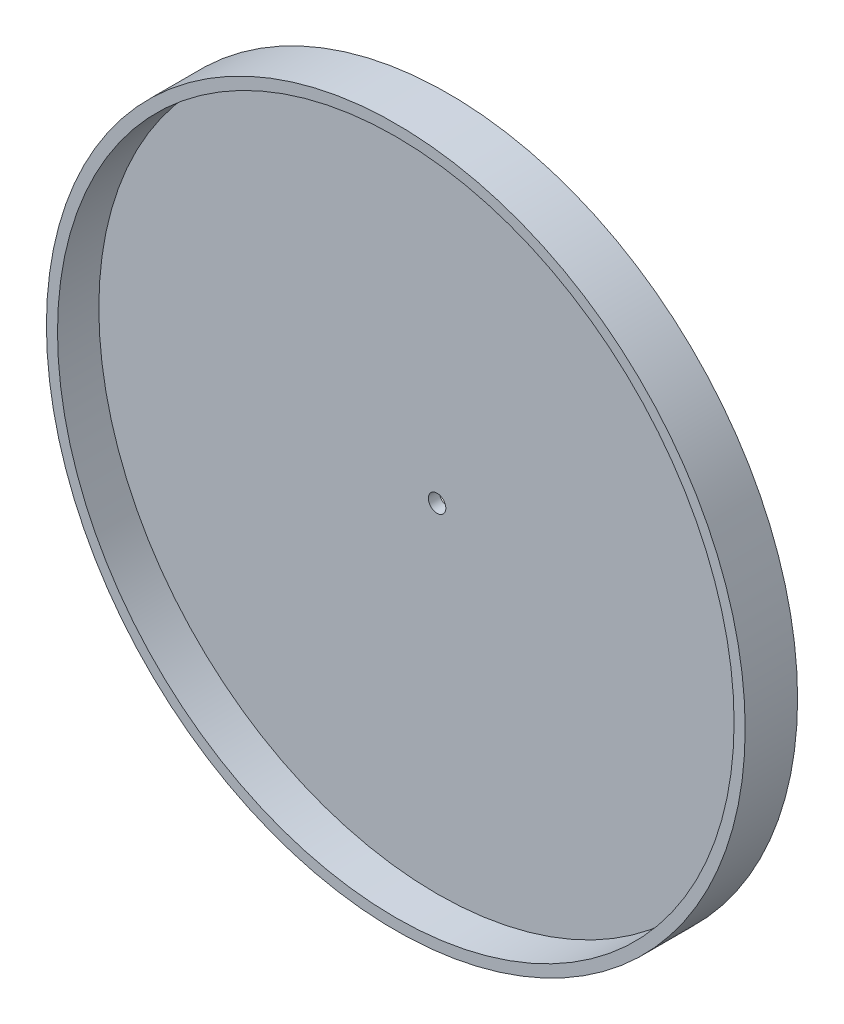
ISO-10303-21;
HEADER;
FILE_DESCRIPTION(('STEP AP214'),'2;1');
FILE_NAME('part.step','',(''),(''),'','','');
FILE_SCHEMA(('AUTOMOTIVE_DESIGN { 1 0 10303 214 1 1 1 1 }'));
ENDSEC;
DATA;
#1=APPLICATION_CONTEXT('core data for automotive mechanical design processes');
#2=APPLICATION_PROTOCOL_DEFINITION('international standard','automotive_design',2000,#1);
#3=PRODUCT_CONTEXT('',#1,'mechanical');
#4=PRODUCT('Part','Part','',(#3));
#5=PRODUCT_RELATED_PRODUCT_CATEGORY('part','',(#4));
#6=PRODUCT_DEFINITION_FORMATION('','',#4);
#7=PRODUCT_DEFINITION_CONTEXT('part definition',#1,'design');
#8=PRODUCT_DEFINITION('design','',#6,#7);
#9=PRODUCT_DEFINITION_SHAPE('','',#8);
#10=(LENGTH_UNIT() NAMED_UNIT(*) SI_UNIT(.MILLI.,.METRE.));
#11=(NAMED_UNIT(*) PLANE_ANGLE_UNIT() SI_UNIT($,.RADIAN.));
#12=(NAMED_UNIT(*) SI_UNIT($,.STERADIAN.) SOLID_ANGLE_UNIT());
#13=UNCERTAINTY_MEASURE_WITH_UNIT(LENGTH_MEASURE(1.E-05),#10,'distance_accuracy_value','');
#14=(GEOMETRIC_REPRESENTATION_CONTEXT(3) GLOBAL_UNCERTAINTY_ASSIGNED_CONTEXT((#13)) GLOBAL_UNIT_ASSIGNED_CONTEXT((#10,
#11,#12)) REPRESENTATION_CONTEXT('',''));
#15=CARTESIAN_POINT('',(0.,0.,0.));
#16=DIRECTION('',(0.,0.,1.));
#17=DIRECTION('',(1.,0.,0.));
#18=AXIS2_PLACEMENT_3D('',#15,#16,#17);
#19=CARTESIAN_POINT('',(0.,0.,7.5));
#20=DIRECTION('',(0.,0.,-1.));
#21=DIRECTION('',(-1.,0.,0.));
#22=AXIS2_PLACEMENT_3D('',#19,#20,#21);
#23=CYLINDRICAL_SURFACE('',#22,2.5);
#24=CARTESIAN_POINT('',(0.,0.,-7.5));
#25=DIRECTION('',(0.,0.,1.));
#26=DIRECTION('',(1.,0.,0.));
#27=AXIS2_PLACEMENT_3D('',#24,#25,#26);
#28=CIRCLE('',#27,2.5);
#29=CARTESIAN_POINT('',(2.5,0.,-7.5));
#30=VERTEX_POINT('',#29);
#31=EDGE_CURVE('E55',#30,#30,#28,.T.);
#32=ORIENTED_EDGE('',*,*,#31,.F.);
#33=EDGE_LOOP('',(#32));
#34=FACE_BOUND('',#33,.T.);
#35=CARTESIAN_POINT('',(0.,0.,-4.325));
#36=DIRECTION('',(0.,0.,1.));
#37=DIRECTION('',(1.,0.,0.));
#38=AXIS2_PLACEMENT_3D('',#35,#36,#37);
#39=CIRCLE('',#38,2.5);
#40=CARTESIAN_POINT('',(2.5,0.,-4.325));
#41=VERTEX_POINT('',#40);
#42=EDGE_CURVE('E44',#41,#41,#39,.T.);
#43=ORIENTED_EDGE('',*,*,#42,.T.);
#44=EDGE_LOOP('',(#43));
#45=FACE_BOUND('',#44,.T.);
#46=ADVANCED_FACE('F41',(#34,#45),#23,.F.);
#47=CARTESIAN_POINT('',(0.,0.,7.5));
#48=DIRECTION('',(0.,0.,-1.));
#49=DIRECTION('',(-1.,0.,0.));
#50=AXIS2_PLACEMENT_3D('',#47,#48,#49);
#51=CYLINDRICAL_SURFACE('',#50,100.);
#52=CARTESIAN_POINT('',(0.,0.,7.5));
#53=DIRECTION('',(0.,0.,1.));
#54=DIRECTION('',(1.,0.,0.));
#55=AXIS2_PLACEMENT_3D('',#52,#53,#54);
#56=CIRCLE('',#55,100.);
#57=CARTESIAN_POINT('',(100.,0.,7.5));
#58=VERTEX_POINT('',#57);
#59=EDGE_CURVE('E11',#58,#58,#56,.T.);
#60=ORIENTED_EDGE('',*,*,#59,.F.);
#61=EDGE_LOOP('',(#60));
#62=FACE_BOUND('',#61,.T.);
#63=CARTESIAN_POINT('',(0.,0.,-7.5));
#64=DIRECTION('',(0.,0.,1.));
#65=DIRECTION('',(1.,0.,0.));
#66=AXIS2_PLACEMENT_3D('',#63,#64,#65);
#67=CIRCLE('',#66,100.);
#68=CARTESIAN_POINT('',(100.,0.,-7.5));
#69=VERTEX_POINT('',#68);
#70=EDGE_CURVE('E49',#69,#69,#67,.T.);
#71=ORIENTED_EDGE('',*,*,#70,.T.);
#72=EDGE_LOOP('',(#71));
#73=FACE_BOUND('',#72,.T.);
#74=ADVANCED_FACE('F82',(#62,#73),#51,.T.);
#75=CARTESIAN_POINT('',(0.,0.,7.5));
#76=DIRECTION('',(0.,0.,1.));
#77=DIRECTION('',(1.,0.,0.));
#78=AXIS2_PLACEMENT_3D('',#75,#76,#77);
#79=PLANE('',#78);
#80=CARTESIAN_POINT('',(0.,0.,7.5));
#81=DIRECTION('',(0.,0.,1.));
#82=DIRECTION('',(1.,0.,0.));
#83=AXIS2_PLACEMENT_3D('',#80,#81,#82);
#84=CIRCLE('',#83,96.825);
#85=CARTESIAN_POINT('',(96.825,0.,7.5));
#86=VERTEX_POINT('',#85);
#87=EDGE_CURVE('E70',#86,#86,#84,.T.);
#88=ORIENTED_EDGE('',*,*,#87,.F.);
#89=EDGE_LOOP('',(#88));
#90=FACE_BOUND('',#89,.T.);
#91=ORIENTED_EDGE('',*,*,#59,.T.);
#92=EDGE_LOOP('',(#91));
#93=FACE_BOUND('',#92,.T.);
#94=ADVANCED_FACE('F79',(#90,#93),#79,.T.);
#95=CARTESIAN_POINT('',(0.,0.,-7.5));
#96=DIRECTION('',(0.,0.,1.));
#97=DIRECTION('',(1.,0.,0.));
#98=AXIS2_PLACEMENT_3D('',#95,#96,#97);
#99=PLANE('',#98);
#100=ORIENTED_EDGE('',*,*,#31,.T.);
#101=EDGE_LOOP('',(#100));
#102=FACE_BOUND('',#101,.T.);
#103=ORIENTED_EDGE('',*,*,#70,.F.);
#104=EDGE_LOOP('',(#103));
#105=FACE_BOUND('',#104,.T.);
#106=ADVANCED_FACE('F81',(#102,#105),#99,.F.);
#107=CARTESIAN_POINT('',(0.,0.,-281.36245635355));
#108=DIRECTION('',(0.,0.,1.));
#109=DIRECTION('',(1.,0.,0.));
#110=AXIS2_PLACEMENT_3D('',#107,#108,#109);
#111=CYLINDRICAL_SURFACE('',#110,96.825);
#112=CARTESIAN_POINT('',(0.,0.,-4.32500000000002));
#113=DIRECTION('',(0.,0.,1.));
#114=DIRECTION('',(1.,0.,0.));
#115=AXIS2_PLACEMENT_3D('',#112,#113,#114);
#116=CIRCLE('',#115,96.825);
#117=CARTESIAN_POINT('',(96.825,0.,-4.32500000000002));
#118=VERTEX_POINT('',#117);
#119=EDGE_CURVE('E58',#118,#118,#116,.F.);
#120=ORIENTED_EDGE('',*,*,#119,.T.);
#121=EDGE_LOOP('',(#120));
#122=FACE_BOUND('',#121,.T.);
#123=ORIENTED_EDGE('',*,*,#87,.T.);
#124=EDGE_LOOP('',(#123));
#125=FACE_BOUND('',#124,.T.);
#126=ADVANCED_FACE('F77',(#122,#125),#111,.F.);
#127=CARTESIAN_POINT('',(0.,0.,-4.325));
#128=DIRECTION('',(0.,0.,1.));
#129=DIRECTION('',(1.,0.,0.));
#130=AXIS2_PLACEMENT_3D('',#127,#128,#129);
#131=PLANE('',#130);
#132=ORIENTED_EDGE('',*,*,#42,.F.);
#133=EDGE_LOOP('',(#132));
#134=FACE_BOUND('',#133,.T.);
#135=ORIENTED_EDGE('',*,*,#119,.F.);
#136=EDGE_LOOP('',(#135));
#137=FACE_BOUND('',#136,.T.);
#138=ADVANCED_FACE('F113',(#134,#137),#131,.T.);
#139=CLOSED_SHELL('',(#46,#74,#94,#106,#126,#138));
#140=MANIFOLD_SOLID_BREP('B2',#139);
#141=ADVANCED_BREP_SHAPE_REPRESENTATION('',(#18,#140),#14);
#142=SHAPE_DEFINITION_REPRESENTATION(#9,#141);
ENDSEC;
END-ISO-10303-21;
